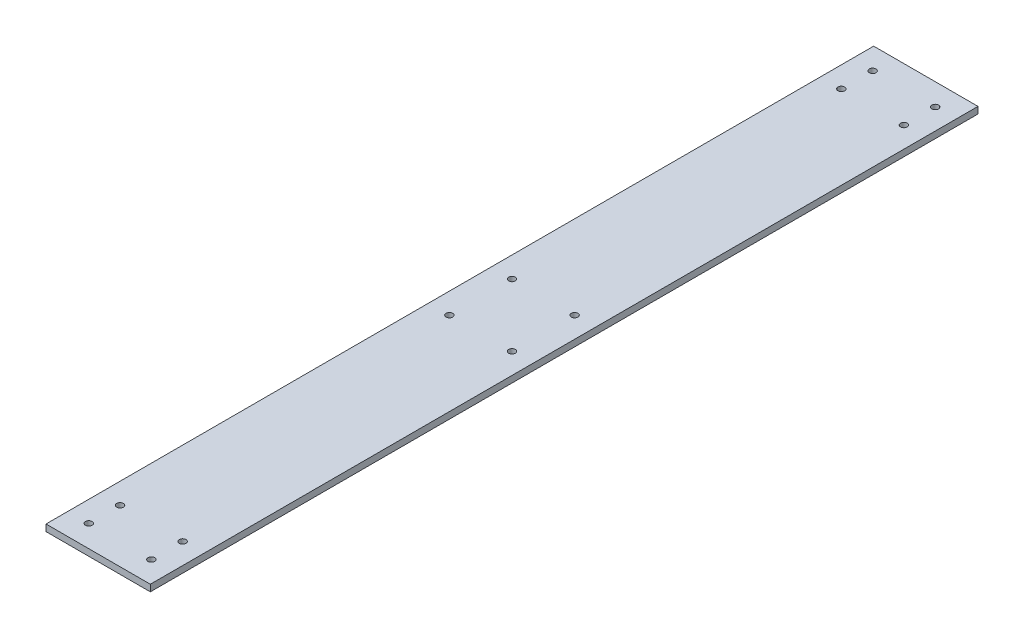
ISO-10303-21;
HEADER;
FILE_DESCRIPTION(('STEP AP214'),'2;1');
FILE_NAME('part.step','',(''),(''),'','','');
FILE_SCHEMA(('AUTOMOTIVE_DESIGN { 1 0 10303 214 1 1 1 1 }'));
ENDSEC;
DATA;
#1=APPLICATION_CONTEXT('core data for automotive mechanical design processes');
#2=APPLICATION_PROTOCOL_DEFINITION('international standard','automotive_design',2000,#1);
#3=PRODUCT_CONTEXT('',#1,'mechanical');
#4=PRODUCT('Part','Part','',(#3));
#5=PRODUCT_RELATED_PRODUCT_CATEGORY('part','',(#4));
#6=PRODUCT_DEFINITION_FORMATION('','',#4);
#7=PRODUCT_DEFINITION_CONTEXT('part definition',#1,'design');
#8=PRODUCT_DEFINITION('design','',#6,#7);
#9=PRODUCT_DEFINITION_SHAPE('','',#8);
#10=(LENGTH_UNIT() NAMED_UNIT(*) SI_UNIT(.MILLI.,.METRE.));
#11=(NAMED_UNIT(*) PLANE_ANGLE_UNIT() SI_UNIT($,.RADIAN.));
#12=(NAMED_UNIT(*) SI_UNIT($,.STERADIAN.) SOLID_ANGLE_UNIT());
#13=UNCERTAINTY_MEASURE_WITH_UNIT(LENGTH_MEASURE(1.E-05),#10,'distance_accuracy_value','');
#14=(GEOMETRIC_REPRESENTATION_CONTEXT(3) GLOBAL_UNCERTAINTY_ASSIGNED_CONTEXT((#13)) GLOBAL_UNIT_ASSIGNED_CONTEXT((#10,
#11,#12)) REPRESENTATION_CONTEXT('',''));
#15=CARTESIAN_POINT('',(0.,0.,0.));
#16=DIRECTION('',(0.,0.,1.));
#17=DIRECTION('',(1.,0.,0.));
#18=AXIS2_PLACEMENT_3D('',#15,#16,#17);
#19=CARTESIAN_POINT('',(-25.,3.175,-198.325));
#20=DIRECTION('',(0.,0.,-1.));
#21=DIRECTION('',(-1.,0.,0.));
#22=AXIS2_PLACEMENT_3D('',#19,#20,#21);
#23=PLANE('',#22);
#24=DIRECTION('',(1.,0.,0.));
#25=VECTOR('',#24,1.);
#26=CARTESIAN_POINT('',(-25.,0.,-198.325));
#27=LINE('',#26,#25);
#28=CARTESIAN_POINT('',(-25.,0.,-198.325));
#29=VERTEX_POINT('',#28);
#30=CARTESIAN_POINT('',(25.,0.,-198.325));
#31=VERTEX_POINT('',#30);
#32=EDGE_CURVE('E105',#29,#31,#27,.T.);
#33=ORIENTED_EDGE('',*,*,#32,.F.);
#34=DIRECTION('',(0.,-1.,0.));
#35=VECTOR('',#34,1.);
#36=CARTESIAN_POINT('',(-25.,3.175,-198.325));
#37=LINE('',#36,#35);
#38=CARTESIAN_POINT('',(-25.,3.175,-198.325));
#39=VERTEX_POINT('',#38);
#40=EDGE_CURVE('E11',#39,#29,#37,.T.);
#41=ORIENTED_EDGE('',*,*,#40,.F.);
#42=DIRECTION('',(1.,0.,0.));
#43=VECTOR('',#42,1.);
#44=CARTESIAN_POINT('',(-25.,3.175,-198.325));
#45=LINE('',#44,#43);
#46=CARTESIAN_POINT('',(25.,3.175,-198.325));
#47=VERTEX_POINT('',#46);
#48=EDGE_CURVE('E99',#39,#47,#45,.T.);
#49=ORIENTED_EDGE('',*,*,#48,.T.);
#50=DIRECTION('',(0.,-1.,0.));
#51=VECTOR('',#50,1.);
#52=CARTESIAN_POINT('',(25.,3.175,-198.325));
#53=LINE('',#52,#51);
#54=EDGE_CURVE('E42',#47,#31,#53,.T.);
#55=ORIENTED_EDGE('',*,*,#54,.T.);
#56=EDGE_LOOP('',(#33,#41,#49,#55));
#57=FACE_BOUND('',#56,.T.);
#58=ADVANCED_FACE('F39',(#57),#23,.T.);
#59=CARTESIAN_POINT('',(-25.,3.175,-198.325));
#60=DIRECTION('',(1.,0.,0.));
#61=DIRECTION('',(0.,0.,-1.));
#62=AXIS2_PLACEMENT_3D('',#59,#60,#61);
#63=PLANE('',#62);
#64=DIRECTION('',(0.,0.,1.));
#65=VECTOR('',#64,1.);
#66=CARTESIAN_POINT('',(-25.,0.,-198.325));
#67=LINE('',#66,#65);
#68=CARTESIAN_POINT('',(-25.,0.,198.325));
#69=VERTEX_POINT('',#68);
#70=EDGE_CURVE('E72',#29,#69,#67,.T.);
#71=ORIENTED_EDGE('',*,*,#70,.T.);
#72=DIRECTION('',(0.,-1.,0.));
#73=VECTOR('',#72,1.);
#74=CARTESIAN_POINT('',(-25.,3.175,198.325));
#75=LINE('',#74,#73);
#76=CARTESIAN_POINT('',(-25.,3.175,198.325));
#77=VERTEX_POINT('',#76);
#78=EDGE_CURVE('E48',#77,#69,#75,.T.);
#79=ORIENTED_EDGE('',*,*,#78,.F.);
#80=DIRECTION('',(0.,0.,1.));
#81=VECTOR('',#80,1.);
#82=CARTESIAN_POINT('',(-25.,3.175,-198.325));
#83=LINE('',#82,#81);
#84=EDGE_CURVE('E89',#39,#77,#83,.T.);
#85=ORIENTED_EDGE('',*,*,#84,.F.);
#86=ORIENTED_EDGE('',*,*,#40,.T.);
#87=EDGE_LOOP('',(#71,#79,#85,#86));
#88=FACE_BOUND('',#87,.T.);
#89=ADVANCED_FACE('F116',(#88),#63,.F.);
#90=CARTESIAN_POINT('',(-25.,3.175,198.325));
#91=DIRECTION('',(0.,0.,-1.));
#92=DIRECTION('',(-1.,0.,0.));
#93=AXIS2_PLACEMENT_3D('',#90,#91,#92);
#94=PLANE('',#93);
#95=DIRECTION('',(1.,0.,0.));
#96=VECTOR('',#95,1.);
#97=CARTESIAN_POINT('',(-25.,0.,198.325));
#98=LINE('',#97,#96);
#99=CARTESIAN_POINT('',(25.,0.,198.325));
#100=VERTEX_POINT('',#99);
#101=EDGE_CURVE('E96',#69,#100,#98,.T.);
#102=ORIENTED_EDGE('',*,*,#101,.T.);
#103=DIRECTION('',(0.,-1.,0.));
#104=VECTOR('',#103,1.);
#105=CARTESIAN_POINT('',(25.,3.175,198.325));
#106=LINE('',#105,#104);
#107=CARTESIAN_POINT('',(25.,3.175,198.325));
#108=VERTEX_POINT('',#107);
#109=EDGE_CURVE('E93',#108,#100,#106,.T.);
#110=ORIENTED_EDGE('',*,*,#109,.F.);
#111=DIRECTION('',(1.,0.,0.));
#112=VECTOR('',#111,1.);
#113=CARTESIAN_POINT('',(-25.,3.175,198.325));
#114=LINE('',#113,#112);
#115=EDGE_CURVE('E84',#77,#108,#114,.T.);
#116=ORIENTED_EDGE('',*,*,#115,.F.);
#117=ORIENTED_EDGE('',*,*,#78,.T.);
#118=EDGE_LOOP('',(#102,#110,#116,#117));
#119=FACE_BOUND('',#118,.T.);
#120=ADVANCED_FACE('F94',(#119),#94,.F.);
#121=CARTESIAN_POINT('',(25.,3.175,-198.325));
#122=DIRECTION('',(1.,0.,0.));
#123=DIRECTION('',(0.,0.,-1.));
#124=AXIS2_PLACEMENT_3D('',#121,#122,#123);
#125=PLANE('',#124);
#126=DIRECTION('',(0.,0.,1.));
#127=VECTOR('',#126,1.);
#128=CARTESIAN_POINT('',(25.,0.,-198.325));
#129=LINE('',#128,#127);
#130=EDGE_CURVE('E108',#31,#100,#129,.T.);
#131=ORIENTED_EDGE('',*,*,#130,.F.);
#132=ORIENTED_EDGE('',*,*,#54,.F.);
#133=DIRECTION('',(0.,0.,1.));
#134=VECTOR('',#133,1.);
#135=CARTESIAN_POINT('',(25.,3.175,-198.325));
#136=LINE('',#135,#134);
#137=EDGE_CURVE('E88',#47,#108,#136,.T.);
#138=ORIENTED_EDGE('',*,*,#137,.T.);
#139=ORIENTED_EDGE('',*,*,#109,.T.);
#140=EDGE_LOOP('',(#131,#132,#138,#139));
#141=FACE_BOUND('',#140,.T.);
#142=ADVANCED_FACE('F98',(#141),#125,.T.);
#143=CARTESIAN_POINT('',(0.,3.175,0.));
#144=DIRECTION('',(0.,-1.,0.));
#145=DIRECTION('',(0.,0.,-1.));
#146=AXIS2_PLACEMENT_3D('',#143,#144,#145);
#147=PLANE('',#146);
#148=CARTESIAN_POINT('',(-15.,3.175,15.));
#149=DIRECTION('',(0.,-1.,0.));
#150=DIRECTION('',(0.,0.,-1.));
#151=AXIS2_PLACEMENT_3D('',#148,#149,#150);
#152=CIRCLE('',#151,1.6);
#153=CARTESIAN_POINT('',(-15.,3.175,13.4));
#154=VERTEX_POINT('',#153);
#155=EDGE_CURVE('E191',#154,#154,#152,.T.);
#156=ORIENTED_EDGE('',*,*,#155,.T.);
#157=EDGE_LOOP('',(#156));
#158=FACE_BOUND('',#157,.T.);
#159=CARTESIAN_POINT('',(15.,3.175,-15.));
#160=DIRECTION('',(0.,-1.,0.));
#161=DIRECTION('',(0.,0.,-1.));
#162=AXIS2_PLACEMENT_3D('',#159,#160,#161);
#163=CIRCLE('',#162,1.6);
#164=CARTESIAN_POINT('',(15.,3.175,-16.6));
#165=VERTEX_POINT('',#164);
#166=EDGE_CURVE('E201',#165,#165,#163,.T.);
#167=ORIENTED_EDGE('',*,*,#166,.T.);
#168=EDGE_LOOP('',(#167));
#169=FACE_BOUND('',#168,.T.);
#170=CARTESIAN_POINT('',(15.,3.175,15.));
#171=DIRECTION('',(0.,-1.,0.));
#172=DIRECTION('',(0.,0.,-1.));
#173=AXIS2_PLACEMENT_3D('',#170,#171,#172);
#174=CIRCLE('',#173,1.6);
#175=CARTESIAN_POINT('',(15.,3.175,13.4));
#176=VERTEX_POINT('',#175);
#177=EDGE_CURVE('E207',#176,#176,#174,.T.);
#178=ORIENTED_EDGE('',*,*,#177,.T.);
#179=EDGE_LOOP('',(#178));
#180=FACE_BOUND('',#179,.T.);
#181=CARTESIAN_POINT('',(-15.,3.175,-15.));
#182=DIRECTION('',(0.,-1.,0.));
#183=DIRECTION('',(0.,0.,-1.));
#184=AXIS2_PLACEMENT_3D('',#181,#182,#183);
#185=CIRCLE('',#184,1.6);
#186=CARTESIAN_POINT('',(-15.,3.175,-16.6));
#187=VERTEX_POINT('',#186);
#188=EDGE_CURVE('E213',#187,#187,#185,.T.);
#189=ORIENTED_EDGE('',*,*,#188,.T.);
#190=EDGE_LOOP('',(#189));
#191=FACE_BOUND('',#190,.T.);
#192=CARTESIAN_POINT('',(-15.,3.175,-187.825));
#193=DIRECTION('',(0.,-1.,0.));
#194=DIRECTION('',(0.,0.,-1.));
#195=AXIS2_PLACEMENT_3D('',#192,#193,#194);
#196=CIRCLE('',#195,1.6);
#197=CARTESIAN_POINT('',(-15.,3.175,-189.425));
#198=VERTEX_POINT('',#197);
#199=EDGE_CURVE('E219',#198,#198,#196,.T.);
#200=ORIENTED_EDGE('',*,*,#199,.T.);
#201=EDGE_LOOP('',(#200));
#202=FACE_BOUND('',#201,.T.);
#203=CARTESIAN_POINT('',(15.,3.175,-172.825));
#204=DIRECTION('',(0.,-1.,0.));
#205=DIRECTION('',(0.,0.,-1.));
#206=AXIS2_PLACEMENT_3D('',#203,#204,#205);
#207=CIRCLE('',#206,1.6);
#208=CARTESIAN_POINT('',(15.,3.175,-174.425));
#209=VERTEX_POINT('',#208);
#210=EDGE_CURVE('E225',#209,#209,#207,.T.);
#211=ORIENTED_EDGE('',*,*,#210,.T.);
#212=EDGE_LOOP('',(#211));
#213=FACE_BOUND('',#212,.T.);
#214=CARTESIAN_POINT('',(15.,3.175,-187.825));
#215=DIRECTION('',(0.,-1.,0.));
#216=DIRECTION('',(0.,0.,-1.));
#217=AXIS2_PLACEMENT_3D('',#214,#215,#216);
#218=CIRCLE('',#217,1.6);
#219=CARTESIAN_POINT('',(15.,3.175,-189.425));
#220=VERTEX_POINT('',#219);
#221=EDGE_CURVE('E231',#220,#220,#218,.T.);
#222=ORIENTED_EDGE('',*,*,#221,.T.);
#223=EDGE_LOOP('',(#222));
#224=FACE_BOUND('',#223,.T.);
#225=CARTESIAN_POINT('',(-15.,3.175,-172.825));
#226=DIRECTION('',(0.,-1.,0.));
#227=DIRECTION('',(0.,0.,-1.));
#228=AXIS2_PLACEMENT_3D('',#225,#226,#227);
#229=CIRCLE('',#228,1.6);
#230=CARTESIAN_POINT('',(-15.,3.175,-174.425));
#231=VERTEX_POINT('',#230);
#232=EDGE_CURVE('E237',#231,#231,#229,.T.);
#233=ORIENTED_EDGE('',*,*,#232,.T.);
#234=EDGE_LOOP('',(#233));
#235=FACE_BOUND('',#234,.T.);
#236=CARTESIAN_POINT('',(-15.,3.175,187.825));
#237=DIRECTION('',(0.,-1.,0.));
#238=DIRECTION('',(0.,0.,-1.));
#239=AXIS2_PLACEMENT_3D('',#236,#237,#238);
#240=CIRCLE('',#239,1.6);
#241=CARTESIAN_POINT('',(-15.,3.175,186.225));
#242=VERTEX_POINT('',#241);
#243=EDGE_CURVE('E243',#242,#242,#240,.T.);
#244=ORIENTED_EDGE('',*,*,#243,.T.);
#245=EDGE_LOOP('',(#244));
#246=FACE_BOUND('',#245,.T.);
#247=CARTESIAN_POINT('',(15.,3.175,172.825));
#248=DIRECTION('',(0.,-1.,0.));
#249=DIRECTION('',(0.,0.,-1.));
#250=AXIS2_PLACEMENT_3D('',#247,#248,#249);
#251=CIRCLE('',#250,1.6);
#252=CARTESIAN_POINT('',(15.,3.175,171.225));
#253=VERTEX_POINT('',#252);
#254=EDGE_CURVE('E249',#253,#253,#251,.T.);
#255=ORIENTED_EDGE('',*,*,#254,.T.);
#256=EDGE_LOOP('',(#255));
#257=FACE_BOUND('',#256,.T.);
#258=CARTESIAN_POINT('',(15.,3.175,187.825));
#259=DIRECTION('',(0.,-1.,0.));
#260=DIRECTION('',(0.,0.,-1.));
#261=AXIS2_PLACEMENT_3D('',#258,#259,#260);
#262=CIRCLE('',#261,1.6);
#263=CARTESIAN_POINT('',(15.,3.175,186.225));
#264=VERTEX_POINT('',#263);
#265=EDGE_CURVE('E255',#264,#264,#262,.T.);
#266=ORIENTED_EDGE('',*,*,#265,.T.);
#267=EDGE_LOOP('',(#266));
#268=FACE_BOUND('',#267,.T.);
#269=CARTESIAN_POINT('',(-15.,3.175,172.825));
#270=DIRECTION('',(0.,-1.,0.));
#271=DIRECTION('',(0.,0.,-1.));
#272=AXIS2_PLACEMENT_3D('',#269,#270,#271);
#273=CIRCLE('',#272,1.6);
#274=CARTESIAN_POINT('',(-15.,3.175,171.225));
#275=VERTEX_POINT('',#274);
#276=EDGE_CURVE('E109',#275,#275,#273,.T.);
#277=ORIENTED_EDGE('',*,*,#276,.T.);
#278=EDGE_LOOP('',(#277));
#279=FACE_BOUND('',#278,.T.);
#280=ORIENTED_EDGE('',*,*,#48,.F.);
#281=ORIENTED_EDGE('',*,*,#84,.T.);
#282=ORIENTED_EDGE('',*,*,#115,.T.);
#283=ORIENTED_EDGE('',*,*,#137,.F.);
#284=EDGE_LOOP('',(#280,#281,#282,#283));
#285=FACE_BOUND('',#284,.T.);
#286=ADVANCED_FACE('F87',(#158,#169,#180,#191,#202,#213,#224,#235,#246,#257,#268,#279,#285),
#147,.F.);
#287=CARTESIAN_POINT('',(0.,0.,0.));
#288=DIRECTION('',(0.,-1.,0.));
#289=DIRECTION('',(0.,0.,-1.));
#290=AXIS2_PLACEMENT_3D('',#287,#288,#289);
#291=PLANE('',#290);
#292=CARTESIAN_POINT('',(-15.,0.,15.));
#293=DIRECTION('',(0.,-1.,0.));
#294=DIRECTION('',(0.,0.,-1.));
#295=AXIS2_PLACEMENT_3D('',#292,#293,#294);
#296=CIRCLE('',#295,1.59999999999999);
#297=CARTESIAN_POINT('',(-15.,0.,13.4));
#298=VERTEX_POINT('',#297);
#299=EDGE_CURVE('E194',#298,#298,#296,.T.);
#300=ORIENTED_EDGE('',*,*,#299,.F.);
#301=EDGE_LOOP('',(#300));
#302=FACE_BOUND('',#301,.T.);
#303=CARTESIAN_POINT('',(15.,0.,-15.));
#304=DIRECTION('',(0.,-1.,0.));
#305=DIRECTION('',(0.,0.,-1.));
#306=AXIS2_PLACEMENT_3D('',#303,#304,#305);
#307=CIRCLE('',#306,1.59999999999999);
#308=CARTESIAN_POINT('',(15.,0.,-16.6));
#309=VERTEX_POINT('',#308);
#310=EDGE_CURVE('E196',#309,#309,#307,.T.);
#311=ORIENTED_EDGE('',*,*,#310,.F.);
#312=EDGE_LOOP('',(#311));
#313=FACE_BOUND('',#312,.T.);
#314=CARTESIAN_POINT('',(15.,0.,15.));
#315=DIRECTION('',(0.,-1.,0.));
#316=DIRECTION('',(0.,0.,-1.));
#317=AXIS2_PLACEMENT_3D('',#314,#315,#316);
#318=CIRCLE('',#317,1.59999999999999);
#319=CARTESIAN_POINT('',(15.,0.,13.4));
#320=VERTEX_POINT('',#319);
#321=EDGE_CURVE('E204',#320,#320,#318,.T.);
#322=ORIENTED_EDGE('',*,*,#321,.F.);
#323=EDGE_LOOP('',(#322));
#324=FACE_BOUND('',#323,.T.);
#325=CARTESIAN_POINT('',(-15.,0.,-15.));
#326=DIRECTION('',(0.,-1.,0.));
#327=DIRECTION('',(0.,0.,-1.));
#328=AXIS2_PLACEMENT_3D('',#325,#326,#327);
#329=CIRCLE('',#328,1.59999999999999);
#330=CARTESIAN_POINT('',(-15.,0.,-16.6));
#331=VERTEX_POINT('',#330);
#332=EDGE_CURVE('E210',#331,#331,#329,.T.);
#333=ORIENTED_EDGE('',*,*,#332,.F.);
#334=EDGE_LOOP('',(#333));
#335=FACE_BOUND('',#334,.T.);
#336=CARTESIAN_POINT('',(-15.,0.,-187.825));
#337=DIRECTION('',(0.,-1.,0.));
#338=DIRECTION('',(0.,0.,-1.));
#339=AXIS2_PLACEMENT_3D('',#336,#337,#338);
#340=CIRCLE('',#339,1.59999999999999);
#341=CARTESIAN_POINT('',(-15.,0.,-189.425));
#342=VERTEX_POINT('',#341);
#343=EDGE_CURVE('E216',#342,#342,#340,.T.);
#344=ORIENTED_EDGE('',*,*,#343,.F.);
#345=EDGE_LOOP('',(#344));
#346=FACE_BOUND('',#345,.T.);
#347=CARTESIAN_POINT('',(15.,0.,-172.825));
#348=DIRECTION('',(0.,-1.,0.));
#349=DIRECTION('',(0.,0.,-1.));
#350=AXIS2_PLACEMENT_3D('',#347,#348,#349);
#351=CIRCLE('',#350,1.59999999999999);
#352=CARTESIAN_POINT('',(15.,0.,-174.425));
#353=VERTEX_POINT('',#352);
#354=EDGE_CURVE('E222',#353,#353,#351,.T.);
#355=ORIENTED_EDGE('',*,*,#354,.F.);
#356=EDGE_LOOP('',(#355));
#357=FACE_BOUND('',#356,.T.);
#358=CARTESIAN_POINT('',(15.,0.,-187.825));
#359=DIRECTION('',(0.,-1.,0.));
#360=DIRECTION('',(0.,0.,-1.));
#361=AXIS2_PLACEMENT_3D('',#358,#359,#360);
#362=CIRCLE('',#361,1.59999999999999);
#363=CARTESIAN_POINT('',(15.,0.,-189.425));
#364=VERTEX_POINT('',#363);
#365=EDGE_CURVE('E228',#364,#364,#362,.T.);
#366=ORIENTED_EDGE('',*,*,#365,.F.);
#367=EDGE_LOOP('',(#366));
#368=FACE_BOUND('',#367,.T.);
#369=CARTESIAN_POINT('',(-15.,0.,-172.825));
#370=DIRECTION('',(0.,-1.,0.));
#371=DIRECTION('',(0.,0.,-1.));
#372=AXIS2_PLACEMENT_3D('',#369,#370,#371);
#373=CIRCLE('',#372,1.59999999999999);
#374=CARTESIAN_POINT('',(-15.,0.,-174.425));
#375=VERTEX_POINT('',#374);
#376=EDGE_CURVE('E234',#375,#375,#373,.T.);
#377=ORIENTED_EDGE('',*,*,#376,.F.);
#378=EDGE_LOOP('',(#377));
#379=FACE_BOUND('',#378,.T.);
#380=CARTESIAN_POINT('',(-15.,0.,187.825));
#381=DIRECTION('',(0.,-1.,0.));
#382=DIRECTION('',(0.,0.,-1.));
#383=AXIS2_PLACEMENT_3D('',#380,#381,#382);
#384=CIRCLE('',#383,1.59999999999999);
#385=CARTESIAN_POINT('',(-15.,0.,186.225));
#386=VERTEX_POINT('',#385);
#387=EDGE_CURVE('E240',#386,#386,#384,.T.);
#388=ORIENTED_EDGE('',*,*,#387,.F.);
#389=EDGE_LOOP('',(#388));
#390=FACE_BOUND('',#389,.T.);
#391=CARTESIAN_POINT('',(15.,0.,172.825));
#392=DIRECTION('',(0.,-1.,0.));
#393=DIRECTION('',(0.,0.,-1.));
#394=AXIS2_PLACEMENT_3D('',#391,#392,#393);
#395=CIRCLE('',#394,1.59999999999999);
#396=CARTESIAN_POINT('',(15.,0.,171.225));
#397=VERTEX_POINT('',#396);
#398=EDGE_CURVE('E246',#397,#397,#395,.T.);
#399=ORIENTED_EDGE('',*,*,#398,.F.);
#400=EDGE_LOOP('',(#399));
#401=FACE_BOUND('',#400,.T.);
#402=CARTESIAN_POINT('',(15.,0.,187.825));
#403=DIRECTION('',(0.,-1.,0.));
#404=DIRECTION('',(0.,0.,-1.));
#405=AXIS2_PLACEMENT_3D('',#402,#403,#404);
#406=CIRCLE('',#405,1.59999999999999);
#407=CARTESIAN_POINT('',(15.,0.,186.225));
#408=VERTEX_POINT('',#407);
#409=EDGE_CURVE('E252',#408,#408,#406,.T.);
#410=ORIENTED_EDGE('',*,*,#409,.F.);
#411=EDGE_LOOP('',(#410));
#412=FACE_BOUND('',#411,.T.);
#413=CARTESIAN_POINT('',(-15.,0.,172.825));
#414=DIRECTION('',(0.,-1.,0.));
#415=DIRECTION('',(0.,0.,-1.));
#416=AXIS2_PLACEMENT_3D('',#413,#414,#415);
#417=CIRCLE('',#416,1.59999999999999);
#418=CARTESIAN_POINT('',(-15.,0.,171.225));
#419=VERTEX_POINT('',#418);
#420=EDGE_CURVE('E258',#419,#419,#417,.T.);
#421=ORIENTED_EDGE('',*,*,#420,.F.);
#422=EDGE_LOOP('',(#421));
#423=FACE_BOUND('',#422,.T.);
#424=ORIENTED_EDGE('',*,*,#32,.T.);
#425=ORIENTED_EDGE('',*,*,#130,.T.);
#426=ORIENTED_EDGE('',*,*,#101,.F.);
#427=ORIENTED_EDGE('',*,*,#70,.F.);
#428=EDGE_LOOP('',(#424,#425,#426,#427));
#429=FACE_BOUND('',#428,.T.);
#430=ADVANCED_FACE('F114',(#302,#313,#324,#335,#346,#357,#368,#379,#390,#401,#412,#423,#429),
#291,.T.);
#431=CARTESIAN_POINT('',(-15.,0.,172.825));
#432=DIRECTION('',(0.,-1.,0.));
#433=DIRECTION('',(0.,0.,-1.));
#434=AXIS2_PLACEMENT_3D('',#431,#432,#433);
#435=CYLINDRICAL_SURFACE('',#434,1.59999999999999);
#436=ORIENTED_EDGE('',*,*,#276,.F.);
#437=EDGE_LOOP('',(#436));
#438=FACE_BOUND('',#437,.T.);
#439=ORIENTED_EDGE('',*,*,#420,.T.);
#440=EDGE_LOOP('',(#439));
#441=FACE_BOUND('',#440,.T.);
#442=ADVANCED_FACE('F136',(#438,#441),#435,.F.);
#443=CARTESIAN_POINT('',(15.,0.,187.825));
#444=DIRECTION('',(0.,-1.,0.));
#445=DIRECTION('',(0.,0.,-1.));
#446=AXIS2_PLACEMENT_3D('',#443,#444,#445);
#447=CYLINDRICAL_SURFACE('',#446,1.59999999999999);
#448=ORIENTED_EDGE('',*,*,#265,.F.);
#449=EDGE_LOOP('',(#448));
#450=FACE_BOUND('',#449,.T.);
#451=ORIENTED_EDGE('',*,*,#409,.T.);
#452=EDGE_LOOP('',(#451));
#453=FACE_BOUND('',#452,.T.);
#454=ADVANCED_FACE('F143',(#450,#453),#447,.F.);
#455=CARTESIAN_POINT('',(15.,0.,172.825));
#456=DIRECTION('',(0.,-1.,0.));
#457=DIRECTION('',(0.,0.,-1.));
#458=AXIS2_PLACEMENT_3D('',#455,#456,#457);
#459=CYLINDRICAL_SURFACE('',#458,1.59999999999999);
#460=ORIENTED_EDGE('',*,*,#254,.F.);
#461=EDGE_LOOP('',(#460));
#462=FACE_BOUND('',#461,.T.);
#463=ORIENTED_EDGE('',*,*,#398,.T.);
#464=EDGE_LOOP('',(#463));
#465=FACE_BOUND('',#464,.T.);
#466=ADVANCED_FACE('F147',(#462,#465),#459,.F.);
#467=CARTESIAN_POINT('',(-15.,0.,187.825));
#468=DIRECTION('',(0.,-1.,0.));
#469=DIRECTION('',(0.,0.,-1.));
#470=AXIS2_PLACEMENT_3D('',#467,#468,#469);
#471=CYLINDRICAL_SURFACE('',#470,1.59999999999999);
#472=ORIENTED_EDGE('',*,*,#243,.F.);
#473=EDGE_LOOP('',(#472));
#474=FACE_BOUND('',#473,.T.);
#475=ORIENTED_EDGE('',*,*,#387,.T.);
#476=EDGE_LOOP('',(#475));
#477=FACE_BOUND('',#476,.T.);
#478=ADVANCED_FACE('F151',(#474,#477),#471,.F.);
#479=CARTESIAN_POINT('',(-15.,0.,-172.825));
#480=DIRECTION('',(0.,-1.,0.));
#481=DIRECTION('',(0.,0.,-1.));
#482=AXIS2_PLACEMENT_3D('',#479,#480,#481);
#483=CYLINDRICAL_SURFACE('',#482,1.59999999999999);
#484=ORIENTED_EDGE('',*,*,#232,.F.);
#485=EDGE_LOOP('',(#484));
#486=FACE_BOUND('',#485,.T.);
#487=ORIENTED_EDGE('',*,*,#376,.T.);
#488=EDGE_LOOP('',(#487));
#489=FACE_BOUND('',#488,.T.);
#490=ADVANCED_FACE('F155',(#486,#489),#483,.F.);
#491=CARTESIAN_POINT('',(15.,0.,-187.825));
#492=DIRECTION('',(0.,-1.,0.));
#493=DIRECTION('',(0.,0.,-1.));
#494=AXIS2_PLACEMENT_3D('',#491,#492,#493);
#495=CYLINDRICAL_SURFACE('',#494,1.59999999999999);
#496=ORIENTED_EDGE('',*,*,#221,.F.);
#497=EDGE_LOOP('',(#496));
#498=FACE_BOUND('',#497,.T.);
#499=ORIENTED_EDGE('',*,*,#365,.T.);
#500=EDGE_LOOP('',(#499));
#501=FACE_BOUND('',#500,.T.);
#502=ADVANCED_FACE('F159',(#498,#501),#495,.F.);
#503=CARTESIAN_POINT('',(15.,0.,-172.825));
#504=DIRECTION('',(0.,-1.,0.));
#505=DIRECTION('',(0.,0.,-1.));
#506=AXIS2_PLACEMENT_3D('',#503,#504,#505);
#507=CYLINDRICAL_SURFACE('',#506,1.59999999999999);
#508=ORIENTED_EDGE('',*,*,#210,.F.);
#509=EDGE_LOOP('',(#508));
#510=FACE_BOUND('',#509,.T.);
#511=ORIENTED_EDGE('',*,*,#354,.T.);
#512=EDGE_LOOP('',(#511));
#513=FACE_BOUND('',#512,.T.);
#514=ADVANCED_FACE('F163',(#510,#513),#507,.F.);
#515=CARTESIAN_POINT('',(-15.,0.,-187.825));
#516=DIRECTION('',(0.,-1.,0.));
#517=DIRECTION('',(0.,0.,-1.));
#518=AXIS2_PLACEMENT_3D('',#515,#516,#517);
#519=CYLINDRICAL_SURFACE('',#518,1.59999999999999);
#520=ORIENTED_EDGE('',*,*,#199,.F.);
#521=EDGE_LOOP('',(#520));
#522=FACE_BOUND('',#521,.T.);
#523=ORIENTED_EDGE('',*,*,#343,.T.);
#524=EDGE_LOOP('',(#523));
#525=FACE_BOUND('',#524,.T.);
#526=ADVANCED_FACE('F167',(#522,#525),#519,.F.);
#527=CARTESIAN_POINT('',(-15.,0.,-15.));
#528=DIRECTION('',(0.,-1.,0.));
#529=DIRECTION('',(0.,0.,-1.));
#530=AXIS2_PLACEMENT_3D('',#527,#528,#529);
#531=CYLINDRICAL_SURFACE('',#530,1.59999999999999);
#532=ORIENTED_EDGE('',*,*,#188,.F.);
#533=EDGE_LOOP('',(#532));
#534=FACE_BOUND('',#533,.T.);
#535=ORIENTED_EDGE('',*,*,#332,.T.);
#536=EDGE_LOOP('',(#535));
#537=FACE_BOUND('',#536,.T.);
#538=ADVANCED_FACE('F171',(#534,#537),#531,.F.);
#539=CARTESIAN_POINT('',(15.,0.,15.));
#540=DIRECTION('',(0.,-1.,0.));
#541=DIRECTION('',(0.,0.,-1.));
#542=AXIS2_PLACEMENT_3D('',#539,#540,#541);
#543=CYLINDRICAL_SURFACE('',#542,1.59999999999999);
#544=ORIENTED_EDGE('',*,*,#177,.F.);
#545=EDGE_LOOP('',(#544));
#546=FACE_BOUND('',#545,.T.);
#547=ORIENTED_EDGE('',*,*,#321,.T.);
#548=EDGE_LOOP('',(#547));
#549=FACE_BOUND('',#548,.T.);
#550=ADVANCED_FACE('F175',(#546,#549),#543,.F.);
#551=CARTESIAN_POINT('',(15.,0.,-15.));
#552=DIRECTION('',(0.,-1.,0.));
#553=DIRECTION('',(0.,0.,-1.));
#554=AXIS2_PLACEMENT_3D('',#551,#552,#553);
#555=CYLINDRICAL_SURFACE('',#554,1.59999999999999);
#556=ORIENTED_EDGE('',*,*,#166,.F.);
#557=EDGE_LOOP('',(#556));
#558=FACE_BOUND('',#557,.T.);
#559=ORIENTED_EDGE('',*,*,#310,.T.);
#560=EDGE_LOOP('',(#559));
#561=FACE_BOUND('',#560,.T.);
#562=ADVANCED_FACE('F179',(#558,#561),#555,.F.);
#563=CARTESIAN_POINT('',(-15.,0.,15.));
#564=DIRECTION('',(0.,-1.,0.));
#565=DIRECTION('',(0.,0.,-1.));
#566=AXIS2_PLACEMENT_3D('',#563,#564,#565);
#567=CYLINDRICAL_SURFACE('',#566,1.59999999999999);
#568=ORIENTED_EDGE('',*,*,#155,.F.);
#569=EDGE_LOOP('',(#568));
#570=FACE_BOUND('',#569,.T.);
#571=ORIENTED_EDGE('',*,*,#299,.T.);
#572=EDGE_LOOP('',(#571));
#573=FACE_BOUND('',#572,.T.);
#574=ADVANCED_FACE('F183',(#570,#573),#567,.F.);
#575=CLOSED_SHELL('',(#58,#89,#120,#142,#286,#430,#442,#454,#466,#478,#490,#502,#514,#526,#538,
#550,#562,#574));
#576=MANIFOLD_SOLID_BREP('B2',#575);
#577=ADVANCED_BREP_SHAPE_REPRESENTATION('',(#18,#576),#14);
#578=SHAPE_DEFINITION_REPRESENTATION(#9,#577);
ENDSEC;
END-ISO-10303-21;
